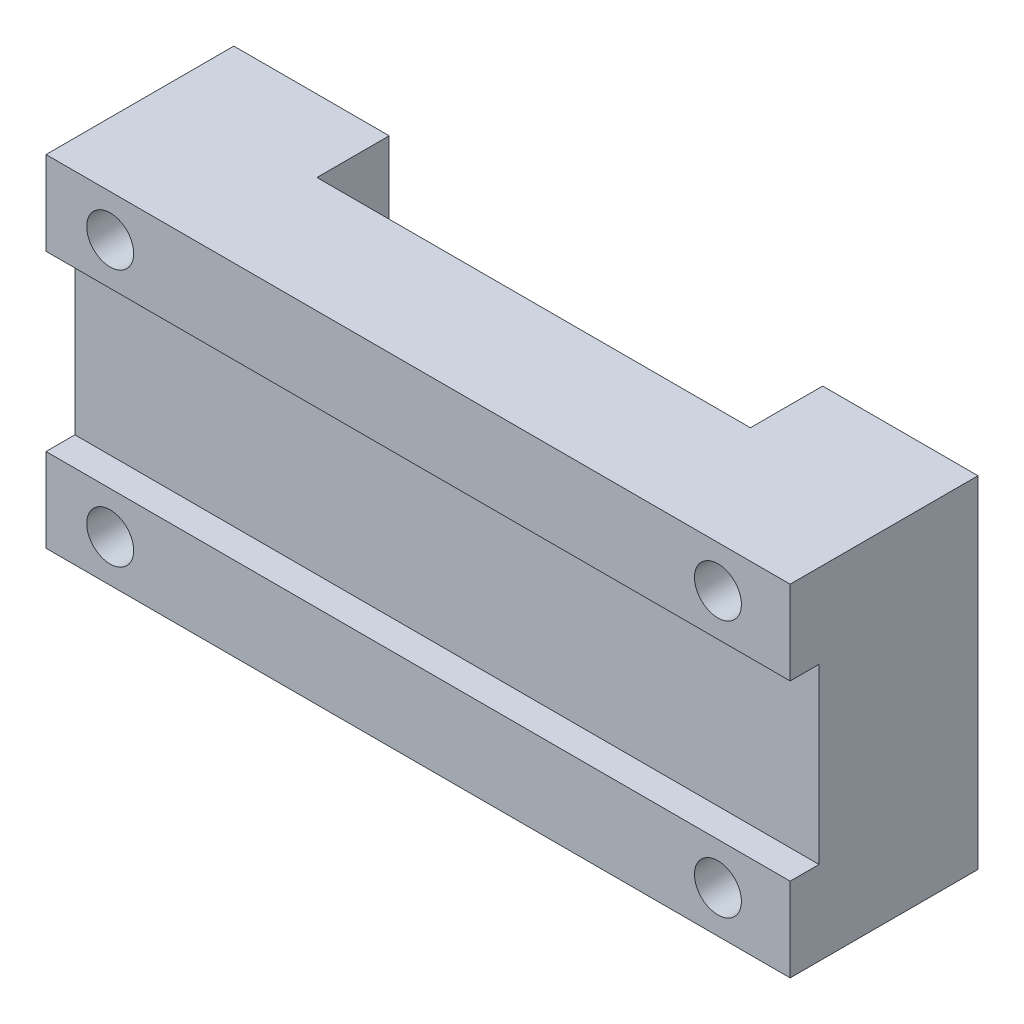
ISO-10303-21;
HEADER;
FILE_DESCRIPTION(('STEP AP214'),'2;1');
FILE_NAME('part.step','',(''),(''),'','','');
FILE_SCHEMA(('AUTOMOTIVE_DESIGN { 1 0 10303 214 1 1 1 1 }'));
ENDSEC;
DATA;
#1=APPLICATION_CONTEXT('core data for automotive mechanical design processes');
#2=APPLICATION_PROTOCOL_DEFINITION('international standard','automotive_design',2000,#1);
#3=PRODUCT_CONTEXT('',#1,'mechanical');
#4=PRODUCT('Part','Part','',(#3));
#5=PRODUCT_RELATED_PRODUCT_CATEGORY('part','',(#4));
#6=PRODUCT_DEFINITION_FORMATION('','',#4);
#7=PRODUCT_DEFINITION_CONTEXT('part definition',#1,'design');
#8=PRODUCT_DEFINITION('design','',#6,#7);
#9=PRODUCT_DEFINITION_SHAPE('','',#8);
#10=(LENGTH_UNIT() NAMED_UNIT(*) SI_UNIT(.MILLI.,.METRE.));
#11=(NAMED_UNIT(*) PLANE_ANGLE_UNIT() SI_UNIT($,.RADIAN.));
#12=(NAMED_UNIT(*) SI_UNIT($,.STERADIAN.) SOLID_ANGLE_UNIT());
#13=UNCERTAINTY_MEASURE_WITH_UNIT(LENGTH_MEASURE(1.E-05),#10,'distance_accuracy_value','');
#14=(GEOMETRIC_REPRESENTATION_CONTEXT(3) GLOBAL_UNCERTAINTY_ASSIGNED_CONTEXT((#13)) GLOBAL_UNIT_ASSIGNED_CONTEXT((#10,
#11,#12)) REPRESENTATION_CONTEXT('',''));
#15=CARTESIAN_POINT('',(0.,0.,0.));
#16=DIRECTION('',(0.,0.,1.));
#17=DIRECTION('',(1.,0.,0.));
#18=AXIS2_PLACEMENT_3D('',#15,#16,#17);
#19=CARTESIAN_POINT('',(0.,0.,0.));
#20=DIRECTION('',(0.,0.,1.));
#21=DIRECTION('',(1.,0.,0.));
#22=AXIS2_PLACEMENT_3D('',#19,#20,#21);
#23=PLANE('',#22);
#24=CARTESIAN_POINT('',(70.5028366048788,11.1000000000041,0.));
#25=DIRECTION('',(0.,0.,1.));
#26=DIRECTION('',(1.,0.,0.));
#27=AXIS2_PLACEMENT_3D('',#24,#25,#26);
#28=CIRCLE('',#27,1.625);
#29=CARTESIAN_POINT('',(72.1278366048788,11.1000000000041,0.));
#30=VERTEX_POINT('',#29);
#31=EDGE_CURVE('E289',#30,#30,#28,.T.);
#32=ORIENTED_EDGE('',*,*,#31,.T.);
#33=EDGE_LOOP('',(#32));
#34=FACE_BOUND('',#33,.T.);
#35=CARTESIAN_POINT('',(70.5028366048788,28.9000000000037,0.));
#36=DIRECTION('',(0.,0.,1.));
#37=DIRECTION('',(1.,0.,0.));
#38=AXIS2_PLACEMENT_3D('',#35,#36,#37);
#39=CIRCLE('',#38,1.62499999999999);
#40=CARTESIAN_POINT('',(72.1278366048788,28.9000000000037,0.));
#41=VERTEX_POINT('',#40);
#42=EDGE_CURVE('E290',#41,#41,#39,.T.);
#43=ORIENTED_EDGE('',*,*,#42,.T.);
#44=EDGE_LOOP('',(#43));
#45=FACE_BOUND('',#44,.T.);
#46=DIRECTION('',(1.,0.,0.));
#47=VECTOR('',#46,1.);
#48=CARTESIAN_POINT('',(24.,8.20000000000413,0.));
#49=LINE('',#48,#47);
#50=CARTESIAN_POINT('',(64.7514183024394,8.20000000000414,0.));
#51=VERTEX_POINT('',#50);
#52=CARTESIAN_POINT('',(75.5028366048789,8.20000000000414,0.));
#53=VERTEX_POINT('',#52);
#54=EDGE_CURVE('E209',#51,#53,#49,.T.);
#55=ORIENTED_EDGE('',*,*,#54,.F.);
#56=DIRECTION('',(0.,-1.,0.));
#57=VECTOR('',#56,1.);
#58=CARTESIAN_POINT('',(64.7514183024394,31.8000000000037,0.));
#59=LINE('',#58,#57);
#60=CARTESIAN_POINT('',(64.7514183024394,31.8000000000037,0.));
#61=VERTEX_POINT('',#60);
#62=EDGE_CURVE('E158',#61,#51,#59,.T.);
#63=ORIENTED_EDGE('',*,*,#62,.F.);
#64=DIRECTION('',(-1.,0.,0.));
#65=VECTOR('',#64,1.);
#66=CARTESIAN_POINT('',(24.,31.8000000000037,0.));
#67=LINE('',#66,#65);
#68=CARTESIAN_POINT('',(75.5028366048789,31.8000000000037,0.));
#69=VERTEX_POINT('',#68);
#70=EDGE_CURVE('E146',#69,#61,#67,.T.);
#71=ORIENTED_EDGE('',*,*,#70,.F.);
#72=DIRECTION('',(0.,1.,0.));
#73=VECTOR('',#72,1.);
#74=CARTESIAN_POINT('',(75.5028366048789,31.8000000000037,0.));
#75=LINE('',#74,#73);
#76=EDGE_CURVE('E213',#53,#69,#75,.T.);
#77=ORIENTED_EDGE('',*,*,#76,.F.);
#78=EDGE_LOOP('',(#55,#63,#71,#77));
#79=FACE_BOUND('',#78,.T.);
#80=ADVANCED_FACE('F33',(#34,#45,#79),#23,.F.);
#81=CARTESIAN_POINT('',(0.,0.,10.9999999999993));
#82=DIRECTION('',(0.,0.,1.));
#83=DIRECTION('',(1.,0.,0.));
#84=AXIS2_PLACEMENT_3D('',#81,#82,#83);
#85=PLANE('',#84);
#86=DIRECTION('',(1.,0.,0.));
#87=VECTOR('',#86,1.);
#88=CARTESIAN_POINT('',(24.,26.0000000000036,10.9999999999993));
#89=LINE('',#88,#87);
#90=CARTESIAN_POINT('',(24.,26.0000000000036,10.9999999999993));
#91=VERTEX_POINT('',#90);
#92=CARTESIAN_POINT('',(75.5028366048789,26.0000000000036,10.9999999999993));
#93=VERTEX_POINT('',#92);
#94=EDGE_CURVE('E56',#91,#93,#89,.T.);
#95=ORIENTED_EDGE('',*,*,#94,.F.);
#96=DIRECTION('',(0.,-1.,0.));
#97=VECTOR('',#96,1.);
#98=CARTESIAN_POINT('',(24.,31.8000000000037,10.9999999999993));
#99=LINE('',#98,#97);
#100=CARTESIAN_POINT('',(24.,14.0000000000043,10.9999999999993));
#101=VERTEX_POINT('',#100);
#102=EDGE_CURVE('E202',#91,#101,#99,.T.);
#103=ORIENTED_EDGE('',*,*,#102,.T.);
#104=DIRECTION('',(1.,0.,0.));
#105=VECTOR('',#104,1.);
#106=CARTESIAN_POINT('',(24.,14.0000000000043,10.9999999999993));
#107=LINE('',#106,#105);
#108=CARTESIAN_POINT('',(75.5028366048789,14.0000000000043,10.9999999999993));
#109=VERTEX_POINT('',#108);
#110=EDGE_CURVE('E189',#101,#109,#107,.T.);
#111=ORIENTED_EDGE('',*,*,#110,.T.);
#112=DIRECTION('',(0.,1.,0.));
#113=VECTOR('',#112,1.);
#114=CARTESIAN_POINT('',(75.5028366048789,31.8000000000037,10.9999999999993));
#115=LINE('',#114,#113);
#116=EDGE_CURVE('E204',#109,#93,#115,.T.);
#117=ORIENTED_EDGE('',*,*,#116,.T.);
#118=EDGE_LOOP('',(#95,#103,#111,#117));
#119=FACE_BOUND('',#118,.T.);
#120=ADVANCED_FACE('F260',(#119),#85,.T.);
#121=CARTESIAN_POINT('',(24.,31.8000000000037,10.9999999999993));
#122=DIRECTION('',(1.,0.,0.));
#123=DIRECTION('',(0.,0.,-1.));
#124=AXIS2_PLACEMENT_3D('',#121,#122,#123);
#125=PLANE('',#124);
#126=DIRECTION('',(0.,-1.,0.));
#127=VECTOR('',#126,1.);
#128=CARTESIAN_POINT('',(24.,31.8000000000037,0.));
#129=LINE('',#128,#127);
#130=CARTESIAN_POINT('',(24.,31.8000000000037,0.));
#131=VERTEX_POINT('',#130);
#132=CARTESIAN_POINT('',(24.,8.20000000000413,0.));
#133=VERTEX_POINT('',#132);
#134=EDGE_CURVE('E197',#131,#133,#129,.T.);
#135=ORIENTED_EDGE('',*,*,#134,.T.);
#136=DIRECTION('',(0.,0.,-1.));
#137=VECTOR('',#136,1.);
#138=CARTESIAN_POINT('',(24.,8.20000000000413,10.9999999999993));
#139=LINE('',#138,#137);
#140=CARTESIAN_POINT('',(24.,8.20000000000414,12.9999999999993));
#141=VERTEX_POINT('',#140);
#142=EDGE_CURVE('E11',#141,#133,#139,.T.);
#143=ORIENTED_EDGE('',*,*,#142,.F.);
#144=DIRECTION('',(0.,-1.,0.));
#145=VECTOR('',#144,1.);
#146=CARTESIAN_POINT('',(24.,8.20000000000414,12.9999999999993));
#147=LINE('',#146,#145);
#148=CARTESIAN_POINT('',(24.,14.0000000000043,12.9999999999993));
#149=VERTEX_POINT('',#148);
#150=EDGE_CURVE('E185',#149,#141,#147,.T.);
#151=ORIENTED_EDGE('',*,*,#150,.F.);
#152=DIRECTION('',(0.,0.,1.));
#153=VECTOR('',#152,1.);
#154=CARTESIAN_POINT('',(24.,14.0000000000043,12.9999999999993));
#155=LINE('',#154,#153);
#156=EDGE_CURVE('E182',#101,#149,#155,.T.);
#157=ORIENTED_EDGE('',*,*,#156,.F.);
#158=ORIENTED_EDGE('',*,*,#102,.F.);
#159=DIRECTION('',(0.,0.,-1.));
#160=VECTOR('',#159,1.);
#161=CARTESIAN_POINT('',(24.,26.0000000000036,12.9999999999993));
#162=LINE('',#161,#160);
#163=CARTESIAN_POINT('',(24.,26.0000000000036,12.9999999999993));
#164=VERTEX_POINT('',#163);
#165=EDGE_CURVE('E164',#164,#91,#162,.T.);
#166=ORIENTED_EDGE('',*,*,#165,.F.);
#167=DIRECTION('',(0.,-1.,0.));
#168=VECTOR('',#167,1.);
#169=CARTESIAN_POINT('',(24.,31.8000000000037,12.9999999999993));
#170=LINE('',#169,#168);
#171=CARTESIAN_POINT('',(24.,31.8000000000037,12.9999999999993));
#172=VERTEX_POINT('',#171);
#173=EDGE_CURVE('E167',#172,#164,#170,.T.);
#174=ORIENTED_EDGE('',*,*,#173,.F.);
#175=DIRECTION('',(0.,0.,-1.));
#176=VECTOR('',#175,1.);
#177=CARTESIAN_POINT('',(24.,31.8000000000037,10.9999999999993));
#178=LINE('',#177,#176);
#179=EDGE_CURVE('E206',#172,#131,#178,.T.);
#180=ORIENTED_EDGE('',*,*,#179,.T.);
#181=EDGE_LOOP('',(#135,#143,#151,#157,#158,#166,#174,#180));
#182=FACE_BOUND('',#181,.T.);
#183=ADVANCED_FACE('F35',(#182),#125,.F.);
#184=CARTESIAN_POINT('',(24.,8.20000000000413,10.9999999999993));
#185=DIRECTION('',(0.,1.,0.));
#186=DIRECTION('',(-1.,0.,0.));
#187=AXIS2_PLACEMENT_3D('',#184,#185,#186);
#188=PLANE('',#187);
#189=DIRECTION('',(-1.,0.,0.));
#190=VECTOR('',#189,1.);
#191=CARTESIAN_POINT('',(49.7514183024394,8.20000000000414,5.));
#192=LINE('',#191,#190);
#193=CARTESIAN_POINT('',(64.7514183024394,8.20000000000414,5.));
#194=VERTEX_POINT('',#193);
#195=CARTESIAN_POINT('',(34.7514183024394,8.20000000000414,5.));
#196=VERTEX_POINT('',#195);
#197=EDGE_CURVE('E148',#194,#196,#192,.T.);
#198=ORIENTED_EDGE('',*,*,#197,.F.);
#199=DIRECTION('',(0.,0.,1.));
#200=VECTOR('',#199,1.);
#201=CARTESIAN_POINT('',(64.7514183024394,8.20000000000414,0.));
#202=LINE('',#201,#200);
#203=EDGE_CURVE('E128',#51,#194,#202,.T.);
#204=ORIENTED_EDGE('',*,*,#203,.F.);
#205=ORIENTED_EDGE('',*,*,#54,.T.);
#206=DIRECTION('',(0.,0.,-1.));
#207=VECTOR('',#206,1.);
#208=CARTESIAN_POINT('',(75.5028366048789,8.20000000000414,10.9999999999993));
#209=LINE('',#208,#207);
#210=CARTESIAN_POINT('',(75.5028366048789,8.20000000000414,12.9999999999993));
#211=VERTEX_POINT('',#210);
#212=EDGE_CURVE('E41',#211,#53,#209,.T.);
#213=ORIENTED_EDGE('',*,*,#212,.F.);
#214=DIRECTION('',(1.,0.,0.));
#215=VECTOR('',#214,1.);
#216=CARTESIAN_POINT('',(24.,8.20000000000414,12.9999999999993));
#217=LINE('',#216,#215);
#218=EDGE_CURVE('E194',#141,#211,#217,.T.);
#219=ORIENTED_EDGE('',*,*,#218,.F.);
#220=ORIENTED_EDGE('',*,*,#142,.T.);
#221=CARTESIAN_POINT('',(34.7514183024394,8.20000000000413,0.));
#222=VERTEX_POINT('',#221);
#223=EDGE_CURVE('E210',#133,#222,#49,.T.);
#224=ORIENTED_EDGE('',*,*,#223,.T.);
#225=DIRECTION('',(0.,0.,-1.));
#226=VECTOR('',#225,1.);
#227=CARTESIAN_POINT('',(34.7514183024394,8.20000000000414,0.));
#228=LINE('',#227,#226);
#229=EDGE_CURVE('E48',#196,#222,#228,.T.);
#230=ORIENTED_EDGE('',*,*,#229,.F.);
#231=EDGE_LOOP('',(#198,#204,#205,#213,#219,#220,#224,#230));
#232=FACE_BOUND('',#231,.T.);
#233=ADVANCED_FACE('F229',(#232),#188,.F.);
#234=CARTESIAN_POINT('',(75.5028366048789,31.8000000000037,10.9999999999993));
#235=DIRECTION('',(-1.,0.,0.));
#236=DIRECTION('',(0.,0.,1.));
#237=AXIS2_PLACEMENT_3D('',#234,#235,#236);
#238=PLANE('',#237);
#239=ORIENTED_EDGE('',*,*,#76,.T.);
#240=DIRECTION('',(0.,0.,-1.));
#241=VECTOR('',#240,1.);
#242=CARTESIAN_POINT('',(75.5028366048789,31.8000000000037,10.9999999999993));
#243=LINE('',#242,#241);
#244=CARTESIAN_POINT('',(75.5028366048789,31.8000000000037,12.9999999999993));
#245=VERTEX_POINT('',#244);
#246=EDGE_CURVE('E219',#245,#69,#243,.T.);
#247=ORIENTED_EDGE('',*,*,#246,.F.);
#248=DIRECTION('',(0.,-1.,0.));
#249=VECTOR('',#248,1.);
#250=CARTESIAN_POINT('',(75.5028366048789,31.8000000000037,12.9999999999993));
#251=LINE('',#250,#249);
#252=CARTESIAN_POINT('',(75.5028366048789,26.0000000000036,12.9999999999993));
#253=VERTEX_POINT('',#252);
#254=EDGE_CURVE('E168',#245,#253,#251,.T.);
#255=ORIENTED_EDGE('',*,*,#254,.T.);
#256=DIRECTION('',(0.,0.,-1.));
#257=VECTOR('',#256,1.);
#258=CARTESIAN_POINT('',(75.5028366048789,26.0000000000036,12.9999999999993));
#259=LINE('',#258,#257);
#260=EDGE_CURVE('E160',#253,#93,#259,.T.);
#261=ORIENTED_EDGE('',*,*,#260,.T.);
#262=ORIENTED_EDGE('',*,*,#116,.F.);
#263=DIRECTION('',(0.,0.,1.));
#264=VECTOR('',#263,1.);
#265=CARTESIAN_POINT('',(75.5028366048789,14.0000000000043,12.9999999999993));
#266=LINE('',#265,#264);
#267=CARTESIAN_POINT('',(75.5028366048789,14.0000000000043,12.9999999999993));
#268=VERTEX_POINT('',#267);
#269=EDGE_CURVE('E177',#109,#268,#266,.T.);
#270=ORIENTED_EDGE('',*,*,#269,.T.);
#271=DIRECTION('',(0.,-1.,0.));
#272=VECTOR('',#271,1.);
#273=CARTESIAN_POINT('',(75.5028366048789,8.20000000000414,12.9999999999993));
#274=LINE('',#273,#272);
#275=EDGE_CURVE('E186',#268,#211,#274,.T.);
#276=ORIENTED_EDGE('',*,*,#275,.T.);
#277=ORIENTED_EDGE('',*,*,#212,.T.);
#278=EDGE_LOOP('',(#239,#247,#255,#261,#262,#270,#276,#277));
#279=FACE_BOUND('',#278,.T.);
#280=ADVANCED_FACE('F223',(#279),#238,.F.);
#281=CARTESIAN_POINT('',(24.,31.8000000000037,10.9999999999993));
#282=DIRECTION('',(0.,-1.,0.));
#283=DIRECTION('',(0.,0.,-1.));
#284=AXIS2_PLACEMENT_3D('',#281,#282,#283);
#285=PLANE('',#284);
#286=ORIENTED_EDGE('',*,*,#70,.T.);
#287=DIRECTION('',(0.,0.,1.));
#288=VECTOR('',#287,1.);
#289=CARTESIAN_POINT('',(64.7514183024394,31.8000000000037,0.));
#290=LINE('',#289,#288);
#291=CARTESIAN_POINT('',(64.7514183024394,31.8000000000037,5.));
#292=VERTEX_POINT('',#291);
#293=EDGE_CURVE('E125',#61,#292,#290,.T.);
#294=ORIENTED_EDGE('',*,*,#293,.T.);
#295=DIRECTION('',(-1.,0.,0.));
#296=VECTOR('',#295,1.);
#297=CARTESIAN_POINT('',(49.7514183024394,31.8000000000037,5.));
#298=LINE('',#297,#296);
#299=CARTESIAN_POINT('',(34.7514183024394,31.8000000000037,5.));
#300=VERTEX_POINT('',#299);
#301=EDGE_CURVE('E136',#292,#300,#298,.T.);
#302=ORIENTED_EDGE('',*,*,#301,.T.);
#303=DIRECTION('',(0.,0.,-1.));
#304=VECTOR('',#303,1.);
#305=CARTESIAN_POINT('',(34.7514183024394,31.8000000000037,0.));
#306=LINE('',#305,#304);
#307=CARTESIAN_POINT('',(34.7514183024394,31.8000000000037,0.));
#308=VERTEX_POINT('',#307);
#309=EDGE_CURVE('E133',#300,#308,#306,.T.);
#310=ORIENTED_EDGE('',*,*,#309,.T.);
#311=EDGE_CURVE('E215',#308,#131,#67,.T.);
#312=ORIENTED_EDGE('',*,*,#311,.T.);
#313=ORIENTED_EDGE('',*,*,#179,.F.);
#314=DIRECTION('',(1.,0.,0.));
#315=VECTOR('',#314,1.);
#316=CARTESIAN_POINT('',(24.,31.8000000000037,12.9999999999993));
#317=LINE('',#316,#315);
#318=EDGE_CURVE('E178',#172,#245,#317,.T.);
#319=ORIENTED_EDGE('',*,*,#318,.T.);
#320=ORIENTED_EDGE('',*,*,#246,.T.);
#321=EDGE_LOOP('',(#286,#294,#302,#310,#312,#313,#319,#320));
#322=FACE_BOUND('',#321,.T.);
#323=ADVANCED_FACE('F143',(#322),#285,.F.);
#324=CARTESIAN_POINT('',(28.4426199868884,28.9000000000037,0.));
#325=DIRECTION('',(0.,0.,1.));
#326=DIRECTION('',(1.,0.,0.));
#327=AXIS2_PLACEMENT_3D('',#324,#325,#326);
#328=CIRCLE('',#327,1.625);
#329=CARTESIAN_POINT('',(30.0676199868884,28.9000000000037,0.));
#330=VERTEX_POINT('',#329);
#331=EDGE_CURVE('E280',#330,#330,#328,.T.);
#332=ORIENTED_EDGE('',*,*,#331,.T.);
#333=EDGE_LOOP('',(#332));
#334=FACE_BOUND('',#333,.T.);
#335=CARTESIAN_POINT('',(28.4426199868884,11.1000000000041,0.));
#336=DIRECTION('',(0.,0.,1.));
#337=DIRECTION('',(1.,0.,0.));
#338=AXIS2_PLACEMENT_3D('',#335,#336,#337);
#339=CIRCLE('',#338,1.625);
#340=CARTESIAN_POINT('',(30.0676199868884,11.1000000000041,0.));
#341=VERTEX_POINT('',#340);
#342=EDGE_CURVE('E156',#341,#341,#339,.T.);
#343=ORIENTED_EDGE('',*,*,#342,.T.);
#344=EDGE_LOOP('',(#343));
#345=FACE_BOUND('',#344,.T.);
#346=ORIENTED_EDGE('',*,*,#311,.F.);
#347=DIRECTION('',(0.,-1.,0.));
#348=VECTOR('',#347,1.);
#349=CARTESIAN_POINT('',(34.7514183024394,31.8000000000037,0.));
#350=LINE('',#349,#348);
#351=EDGE_CURVE('E161',#308,#222,#350,.T.);
#352=ORIENTED_EDGE('',*,*,#351,.T.);
#353=ORIENTED_EDGE('',*,*,#223,.F.);
#354=ORIENTED_EDGE('',*,*,#134,.F.);
#355=EDGE_LOOP('',(#346,#352,#353,#354));
#356=FACE_BOUND('',#355,.T.);
#357=ADVANCED_FACE('F233',(#334,#345,#356),#23,.F.);
#358=CARTESIAN_POINT('',(24.,8.20000000000414,12.9999999999993));
#359=DIRECTION('',(0.,0.,1.));
#360=DIRECTION('',(1.,0.,0.));
#361=AXIS2_PLACEMENT_3D('',#358,#359,#360);
#362=PLANE('',#361);
#363=CARTESIAN_POINT('',(70.5028366048788,11.1000000000041,12.9999999999993));
#364=DIRECTION('',(0.,0.,1.));
#365=DIRECTION('',(1.,0.,0.));
#366=AXIS2_PLACEMENT_3D('',#363,#364,#365);
#367=CIRCLE('',#366,1.625);
#368=CARTESIAN_POINT('',(72.1278366048788,11.1000000000041,12.9999999999993));
#369=VERTEX_POINT('',#368);
#370=EDGE_CURVE('E286',#369,#369,#367,.T.);
#371=ORIENTED_EDGE('',*,*,#370,.F.);
#372=EDGE_LOOP('',(#371));
#373=FACE_BOUND('',#372,.T.);
#374=CARTESIAN_POINT('',(28.4426199868884,11.1000000000041,12.9999999999993));
#375=DIRECTION('',(0.,0.,1.));
#376=DIRECTION('',(1.,0.,0.));
#377=AXIS2_PLACEMENT_3D('',#374,#375,#376);
#378=CIRCLE('',#377,1.625);
#379=CARTESIAN_POINT('',(30.0676199868884,11.1000000000041,12.9999999999993));
#380=VERTEX_POINT('',#379);
#381=EDGE_CURVE('E151',#380,#380,#378,.T.);
#382=ORIENTED_EDGE('',*,*,#381,.F.);
#383=EDGE_LOOP('',(#382));
#384=FACE_BOUND('',#383,.T.);
#385=ORIENTED_EDGE('',*,*,#275,.F.);
#386=DIRECTION('',(1.,0.,0.));
#387=VECTOR('',#386,1.);
#388=CARTESIAN_POINT('',(24.,14.0000000000043,12.9999999999993));
#389=LINE('',#388,#387);
#390=EDGE_CURVE('E198',#149,#268,#389,.T.);
#391=ORIENTED_EDGE('',*,*,#390,.F.);
#392=ORIENTED_EDGE('',*,*,#150,.T.);
#393=ORIENTED_EDGE('',*,*,#218,.T.);
#394=EDGE_LOOP('',(#385,#391,#392,#393));
#395=FACE_BOUND('',#394,.T.);
#396=ADVANCED_FACE('F255',(#373,#384,#395),#362,.T.);
#397=CARTESIAN_POINT('',(24.,14.0000000000043,12.9999999999993));
#398=DIRECTION('',(0.,1.,0.));
#399=DIRECTION('',(0.,0.,1.));
#400=AXIS2_PLACEMENT_3D('',#397,#398,#399);
#401=PLANE('',#400);
#402=ORIENTED_EDGE('',*,*,#269,.F.);
#403=ORIENTED_EDGE('',*,*,#110,.F.);
#404=ORIENTED_EDGE('',*,*,#156,.T.);
#405=ORIENTED_EDGE('',*,*,#390,.T.);
#406=EDGE_LOOP('',(#402,#403,#404,#405));
#407=FACE_BOUND('',#406,.T.);
#408=ADVANCED_FACE('F247',(#407),#401,.T.);
#409=CARTESIAN_POINT('',(24.,26.0000000000036,12.9999999999993));
#410=DIRECTION('',(0.,-1.,0.));
#411=DIRECTION('',(0.,0.,-1.));
#412=AXIS2_PLACEMENT_3D('',#409,#410,#411);
#413=PLANE('',#412);
#414=ORIENTED_EDGE('',*,*,#260,.F.);
#415=DIRECTION('',(1.,0.,0.));
#416=VECTOR('',#415,1.);
#417=CARTESIAN_POINT('',(24.,26.0000000000036,12.9999999999993));
#418=LINE('',#417,#416);
#419=EDGE_CURVE('E175',#164,#253,#418,.T.);
#420=ORIENTED_EDGE('',*,*,#419,.F.);
#421=ORIENTED_EDGE('',*,*,#165,.T.);
#422=ORIENTED_EDGE('',*,*,#94,.T.);
#423=EDGE_LOOP('',(#414,#420,#421,#422));
#424=FACE_BOUND('',#423,.T.);
#425=ADVANCED_FACE('F245',(#424),#413,.T.);
#426=CARTESIAN_POINT('',(24.,31.8000000000037,12.9999999999993));
#427=DIRECTION('',(0.,0.,1.));
#428=DIRECTION('',(1.,0.,0.));
#429=AXIS2_PLACEMENT_3D('',#426,#427,#428);
#430=PLANE('',#429);
#431=CARTESIAN_POINT('',(28.4426199868884,28.9000000000037,12.9999999999993));
#432=DIRECTION('',(0.,0.,1.));
#433=DIRECTION('',(1.,0.,0.));
#434=AXIS2_PLACEMENT_3D('',#431,#432,#433);
#435=CIRCLE('',#434,1.625);
#436=CARTESIAN_POINT('',(30.0676199868884,28.9000000000037,12.9999999999993));
#437=VERTEX_POINT('',#436);
#438=EDGE_CURVE('E292',#437,#437,#435,.T.);
#439=ORIENTED_EDGE('',*,*,#438,.F.);
#440=EDGE_LOOP('',(#439));
#441=FACE_BOUND('',#440,.T.);
#442=CARTESIAN_POINT('',(70.5028366048788,28.9000000000037,12.9999999999993));
#443=DIRECTION('',(0.,0.,1.));
#444=DIRECTION('',(1.,0.,0.));
#445=AXIS2_PLACEMENT_3D('',#442,#443,#444);
#446=CIRCLE('',#445,1.62499999999999);
#447=CARTESIAN_POINT('',(72.1278366048788,28.9000000000037,12.9999999999993));
#448=VERTEX_POINT('',#447);
#449=EDGE_CURVE('E296',#448,#448,#446,.T.);
#450=ORIENTED_EDGE('',*,*,#449,.F.);
#451=EDGE_LOOP('',(#450));
#452=FACE_BOUND('',#451,.T.);
#453=ORIENTED_EDGE('',*,*,#254,.F.);
#454=ORIENTED_EDGE('',*,*,#318,.F.);
#455=ORIENTED_EDGE('',*,*,#173,.T.);
#456=ORIENTED_EDGE('',*,*,#419,.T.);
#457=EDGE_LOOP('',(#453,#454,#455,#456));
#458=FACE_BOUND('',#457,.T.);
#459=ADVANCED_FACE('F241',(#441,#452,#458),#430,.T.);
#460=CARTESIAN_POINT('',(64.7514183024394,31.8000000000037,0.));
#461=DIRECTION('',(1.,0.,0.));
#462=DIRECTION('',(0.,1.,0.));
#463=AXIS2_PLACEMENT_3D('',#460,#461,#462);
#464=PLANE('',#463);
#465=ORIENTED_EDGE('',*,*,#203,.T.);
#466=DIRECTION('',(0.,-1.,0.));
#467=VECTOR('',#466,1.);
#468=CARTESIAN_POINT('',(64.7514183024394,31.8000000000037,5.));
#469=LINE('',#468,#467);
#470=EDGE_CURVE('E121',#292,#194,#469,.T.);
#471=ORIENTED_EDGE('',*,*,#470,.F.);
#472=ORIENTED_EDGE('',*,*,#293,.F.);
#473=ORIENTED_EDGE('',*,*,#62,.T.);
#474=EDGE_LOOP('',(#465,#471,#472,#473));
#475=FACE_BOUND('',#474,.T.);
#476=ADVANCED_FACE('F123',(#475),#464,.F.);
#477=CARTESIAN_POINT('',(34.7514183024394,31.8000000000037,0.));
#478=DIRECTION('',(-1.,0.,0.));
#479=DIRECTION('',(0.,-1.,0.));
#480=AXIS2_PLACEMENT_3D('',#477,#478,#479);
#481=PLANE('',#480);
#482=ORIENTED_EDGE('',*,*,#229,.T.);
#483=ORIENTED_EDGE('',*,*,#351,.F.);
#484=ORIENTED_EDGE('',*,*,#309,.F.);
#485=DIRECTION('',(0.,-1.,0.));
#486=VECTOR('',#485,1.);
#487=CARTESIAN_POINT('',(34.7514183024394,31.8000000000037,5.));
#488=LINE('',#487,#486);
#489=EDGE_CURVE('E132',#300,#196,#488,.T.);
#490=ORIENTED_EDGE('',*,*,#489,.T.);
#491=EDGE_LOOP('',(#482,#483,#484,#490));
#492=FACE_BOUND('',#491,.T.);
#493=ADVANCED_FACE('F234',(#492),#481,.F.);
#494=CARTESIAN_POINT('',(49.7514183024394,31.8000000000037,5.));
#495=DIRECTION('',(0.,0.,1.));
#496=DIRECTION('',(1.,0.,0.));
#497=AXIS2_PLACEMENT_3D('',#494,#495,#496);
#498=PLANE('',#497);
#499=ORIENTED_EDGE('',*,*,#197,.T.);
#500=ORIENTED_EDGE('',*,*,#489,.F.);
#501=ORIENTED_EDGE('',*,*,#301,.F.);
#502=ORIENTED_EDGE('',*,*,#470,.T.);
#503=EDGE_LOOP('',(#499,#500,#501,#502));
#504=FACE_BOUND('',#503,.T.);
#505=ADVANCED_FACE('F137',(#504),#498,.F.);
#506=CARTESIAN_POINT('',(70.5028366048788,28.9000000000037,0.));
#507=DIRECTION('',(0.,0.,1.));
#508=DIRECTION('',(1.,0.,0.));
#509=AXIS2_PLACEMENT_3D('',#506,#507,#508);
#510=CYLINDRICAL_SURFACE('',#509,1.62499999999999);
#511=ORIENTED_EDGE('',*,*,#42,.F.);
#512=EDGE_LOOP('',(#511));
#513=FACE_BOUND('',#512,.T.);
#514=ORIENTED_EDGE('',*,*,#449,.T.);
#515=EDGE_LOOP('',(#514));
#516=FACE_BOUND('',#515,.T.);
#517=ADVANCED_FACE('F302',(#513,#516),#510,.F.);
#518=CARTESIAN_POINT('',(28.4426199868884,28.9000000000037,0.));
#519=DIRECTION('',(0.,0.,1.));
#520=DIRECTION('',(1.,0.,0.));
#521=AXIS2_PLACEMENT_3D('',#518,#519,#520);
#522=CYLINDRICAL_SURFACE('',#521,1.625);
#523=ORIENTED_EDGE('',*,*,#331,.F.);
#524=EDGE_LOOP('',(#523));
#525=FACE_BOUND('',#524,.T.);
#526=ORIENTED_EDGE('',*,*,#438,.T.);
#527=EDGE_LOOP('',(#526));
#528=FACE_BOUND('',#527,.T.);
#529=ADVANCED_FACE('F305',(#525,#528),#522,.F.);
#530=CARTESIAN_POINT('',(28.4426199868884,11.1000000000041,0.));
#531=DIRECTION('',(0.,0.,1.));
#532=DIRECTION('',(1.,0.,0.));
#533=AXIS2_PLACEMENT_3D('',#530,#531,#532);
#534=CYLINDRICAL_SURFACE('',#533,1.625);
#535=ORIENTED_EDGE('',*,*,#342,.F.);
#536=EDGE_LOOP('',(#535));
#537=FACE_BOUND('',#536,.T.);
#538=ORIENTED_EDGE('',*,*,#381,.T.);
#539=EDGE_LOOP('',(#538));
#540=FACE_BOUND('',#539,.T.);
#541=ADVANCED_FACE('F313',(#537,#540),#534,.F.);
#542=CARTESIAN_POINT('',(70.5028366048788,11.1000000000041,0.));
#543=DIRECTION('',(0.,0.,1.));
#544=DIRECTION('',(1.,0.,0.));
#545=AXIS2_PLACEMENT_3D('',#542,#543,#544);
#546=CYLINDRICAL_SURFACE('',#545,1.625);
#547=ORIENTED_EDGE('',*,*,#31,.F.);
#548=EDGE_LOOP('',(#547));
#549=FACE_BOUND('',#548,.T.);
#550=ORIENTED_EDGE('',*,*,#370,.T.);
#551=EDGE_LOOP('',(#550));
#552=FACE_BOUND('',#551,.T.);
#553=ADVANCED_FACE('F318',(#549,#552),#546,.F.);
#554=CLOSED_SHELL('',(#80,#120,#183,#233,#280,#323,#357,#396,#408,#425,#459,#476,#493,#505,#517,
#529,#541,#553));
#555=MANIFOLD_SOLID_BREP('B2',#554);
#556=ADVANCED_BREP_SHAPE_REPRESENTATION('',(#18,#555),#14);
#557=SHAPE_DEFINITION_REPRESENTATION(#9,#556);
ENDSEC;
END-ISO-10303-21;
